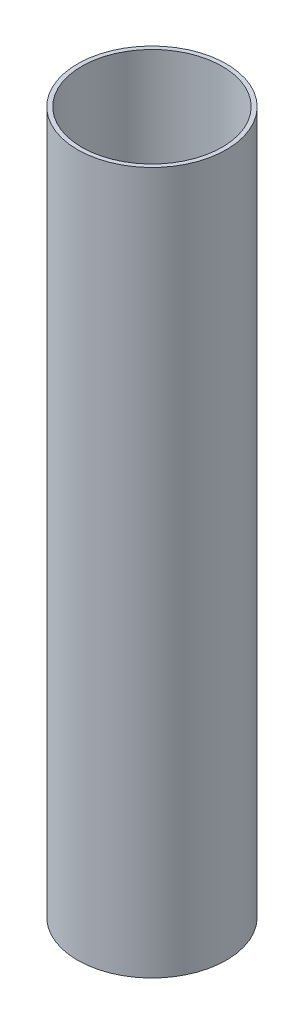
ISO-10303-21;
HEADER;
FILE_DESCRIPTION(('STEP AP214'),'2;1');
FILE_NAME('part.step','',(''),(''),'','','');
FILE_SCHEMA(('AUTOMOTIVE_DESIGN { 1 0 10303 214 1 1 1 1 }'));
ENDSEC;
DATA;
#1=APPLICATION_CONTEXT('core data for automotive mechanical design processes');
#2=APPLICATION_PROTOCOL_DEFINITION('international standard','automotive_design',2000,#1);
#3=PRODUCT_CONTEXT('',#1,'mechanical');
#4=PRODUCT('Part','Part','',(#3));
#5=PRODUCT_RELATED_PRODUCT_CATEGORY('part','',(#4));
#6=PRODUCT_DEFINITION_FORMATION('','',#4);
#7=PRODUCT_DEFINITION_CONTEXT('part definition',#1,'design');
#8=PRODUCT_DEFINITION('design','',#6,#7);
#9=PRODUCT_DEFINITION_SHAPE('','',#8);
#10=(LENGTH_UNIT() NAMED_UNIT(*) SI_UNIT(.MILLI.,.METRE.));
#11=(NAMED_UNIT(*) PLANE_ANGLE_UNIT() SI_UNIT($,.RADIAN.));
#12=(NAMED_UNIT(*) SI_UNIT($,.STERADIAN.) SOLID_ANGLE_UNIT());
#13=UNCERTAINTY_MEASURE_WITH_UNIT(LENGTH_MEASURE(1.E-05),#10,'distance_accuracy_value','');
#14=(GEOMETRIC_REPRESENTATION_CONTEXT(3) GLOBAL_UNCERTAINTY_ASSIGNED_CONTEXT((#13)) GLOBAL_UNIT_ASSIGNED_CONTEXT((#10,
#11,#12)) REPRESENTATION_CONTEXT('',''));
#15=CARTESIAN_POINT('',(0.,0.,0.));
#16=DIRECTION('',(0.,0.,1.));
#17=DIRECTION('',(1.,0.,0.));
#18=AXIS2_PLACEMENT_3D('',#15,#16,#17);
#19=CARTESIAN_POINT('',(0.,500.,0.));
#20=DIRECTION('',(0.,1.,0.));
#21=DIRECTION('',(0.,0.,1.));
#22=AXIS2_PLACEMENT_3D('',#19,#20,#21);
#23=PLANE('',#22);
#24=CARTESIAN_POINT('',(0.,500.,0.));
#25=DIRECTION('',(0.,1.,0.));
#26=DIRECTION('',(0.,0.,1.));
#27=AXIS2_PLACEMENT_3D('',#24,#25,#26);
#28=CIRCLE('',#27,53.);
#29=CARTESIAN_POINT('',(0.,500.,53.));
#30=VERTEX_POINT('',#29);
#31=EDGE_CURVE('E10',#30,#30,#28,.T.);
#32=ORIENTED_EDGE('',*,*,#31,.T.);
#33=EDGE_LOOP('',(#32));
#34=FACE_BOUND('',#33,.T.);
#35=CARTESIAN_POINT('',(0.,500.,0.));
#36=DIRECTION('',(0.,1.,0.));
#37=DIRECTION('',(0.,0.,1.));
#38=AXIS2_PLACEMENT_3D('',#35,#36,#37);
#39=CIRCLE('',#38,50.);
#40=CARTESIAN_POINT('',(0.,500.,50.));
#41=VERTEX_POINT('',#40);
#42=EDGE_CURVE('E42',#41,#41,#39,.T.);
#43=ORIENTED_EDGE('',*,*,#42,.F.);
#44=EDGE_LOOP('',(#43));
#45=FACE_BOUND('',#44,.T.);
#46=ADVANCED_FACE('F31',(#34,#45),#23,.T.);
#47=CARTESIAN_POINT('',(0.,0.,0.));
#48=DIRECTION('',(0.,1.,0.));
#49=DIRECTION('',(0.,0.,1.));
#50=AXIS2_PLACEMENT_3D('',#47,#48,#49);
#51=PLANE('',#50);
#52=CARTESIAN_POINT('',(0.,0.,0.));
#53=DIRECTION('',(0.,1.,0.));
#54=DIRECTION('',(0.,0.,1.));
#55=AXIS2_PLACEMENT_3D('',#52,#53,#54);
#56=CIRCLE('',#55,53.);
#57=CARTESIAN_POINT('',(0.,0.,53.));
#58=VERTEX_POINT('',#57);
#59=EDGE_CURVE('E35',#58,#58,#56,.T.);
#60=ORIENTED_EDGE('',*,*,#59,.F.);
#61=EDGE_LOOP('',(#60));
#62=FACE_BOUND('',#61,.T.);
#63=CARTESIAN_POINT('',(0.,0.,0.));
#64=DIRECTION('',(0.,1.,0.));
#65=DIRECTION('',(0.,0.,1.));
#66=AXIS2_PLACEMENT_3D('',#63,#64,#65);
#67=CIRCLE('',#66,50.);
#68=CARTESIAN_POINT('',(0.,0.,50.));
#69=VERTEX_POINT('',#68);
#70=EDGE_CURVE('E44',#69,#69,#67,.T.);
#71=ORIENTED_EDGE('',*,*,#70,.T.);
#72=EDGE_LOOP('',(#71));
#73=FACE_BOUND('',#72,.T.);
#74=ADVANCED_FACE('F54',(#62,#73),#51,.F.);
#75=CARTESIAN_POINT('',(0.,500.,0.));
#76=DIRECTION('',(0.,-1.,0.));
#77=DIRECTION('',(0.,0.,-1.));
#78=AXIS2_PLACEMENT_3D('',#75,#76,#77);
#79=CYLINDRICAL_SURFACE('',#78,53.);
#80=ORIENTED_EDGE('',*,*,#31,.F.);
#81=EDGE_LOOP('',(#80));
#82=FACE_BOUND('',#81,.T.);
#83=ORIENTED_EDGE('',*,*,#59,.T.);
#84=EDGE_LOOP('',(#83));
#85=FACE_BOUND('',#84,.T.);
#86=ADVANCED_FACE('F33',(#82,#85),#79,.T.);
#87=CARTESIAN_POINT('',(0.,500.,0.));
#88=DIRECTION('',(0.,-1.,0.));
#89=DIRECTION('',(0.,0.,-1.));
#90=AXIS2_PLACEMENT_3D('',#87,#88,#89);
#91=CYLINDRICAL_SURFACE('',#90,50.);
#92=ORIENTED_EDGE('',*,*,#42,.T.);
#93=EDGE_LOOP('',(#92));
#94=FACE_BOUND('',#93,.T.);
#95=ORIENTED_EDGE('',*,*,#70,.F.);
#96=EDGE_LOOP('',(#95));
#97=FACE_BOUND('',#96,.T.);
#98=ADVANCED_FACE('F50',(#94,#97),#91,.F.);
#99=CLOSED_SHELL('',(#46,#74,#86,#98));
#100=MANIFOLD_SOLID_BREP('B2',#99);
#101=ADVANCED_BREP_SHAPE_REPRESENTATION('',(#18,#100),#14);
#102=SHAPE_DEFINITION_REPRESENTATION(#9,#101);
ENDSEC;
END-ISO-10303-21;
